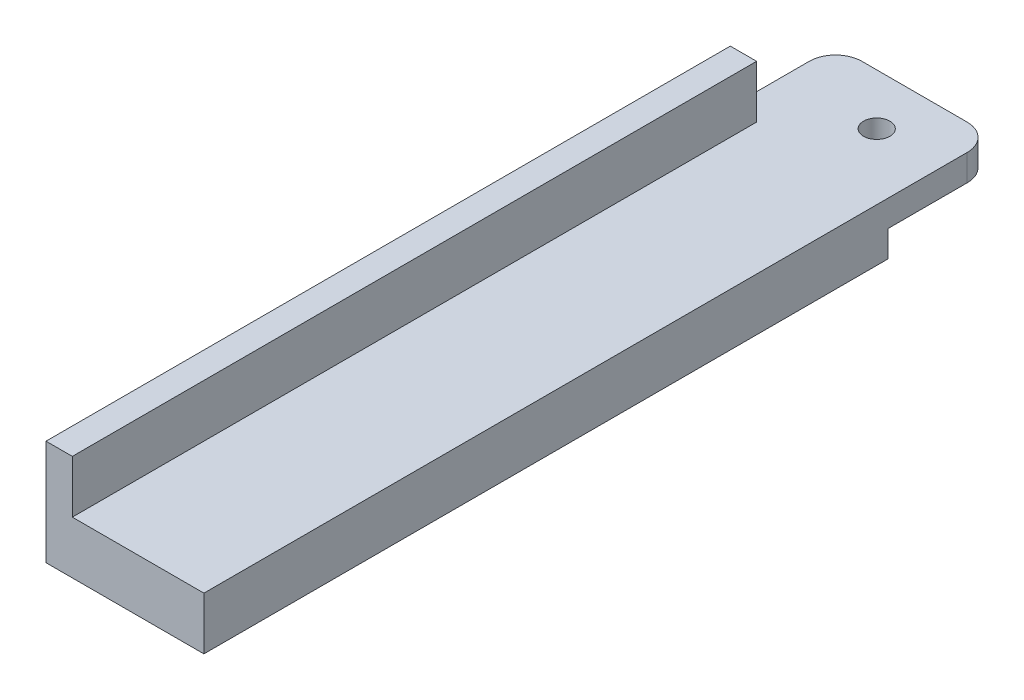
ISO-10303-21;
HEADER;
FILE_DESCRIPTION(('STEP AP214'),'2;1');
FILE_NAME('part.step','',(''),(''),'','','');
FILE_SCHEMA(('AUTOMOTIVE_DESIGN { 1 0 10303 214 1 1 1 1 }'));
ENDSEC;
DATA;
#1=APPLICATION_CONTEXT('core data for automotive mechanical design processes');
#2=APPLICATION_PROTOCOL_DEFINITION('international standard','automotive_design',2000,#1);
#3=PRODUCT_CONTEXT('',#1,'mechanical');
#4=PRODUCT('Part','Part','',(#3));
#5=PRODUCT_RELATED_PRODUCT_CATEGORY('part','',(#4));
#6=PRODUCT_DEFINITION_FORMATION('','',#4);
#7=PRODUCT_DEFINITION_CONTEXT('part definition',#1,'design');
#8=PRODUCT_DEFINITION('design','',#6,#7);
#9=PRODUCT_DEFINITION_SHAPE('','',#8);
#10=(LENGTH_UNIT() NAMED_UNIT(*) SI_UNIT(.MILLI.,.METRE.));
#11=(NAMED_UNIT(*) PLANE_ANGLE_UNIT() SI_UNIT($,.RADIAN.));
#12=(NAMED_UNIT(*) SI_UNIT($,.STERADIAN.) SOLID_ANGLE_UNIT());
#13=UNCERTAINTY_MEASURE_WITH_UNIT(LENGTH_MEASURE(1.E-05),#10,'distance_accuracy_value','');
#14=(GEOMETRIC_REPRESENTATION_CONTEXT(3) GLOBAL_UNCERTAINTY_ASSIGNED_CONTEXT((#13)) GLOBAL_UNIT_ASSIGNED_CONTEXT((#10,
#11,#12)) REPRESENTATION_CONTEXT('',''));
#15=CARTESIAN_POINT('',(0.,0.,0.));
#16=DIRECTION('',(0.,0.,1.));
#17=DIRECTION('',(1.,0.,0.));
#18=AXIS2_PLACEMENT_3D('',#15,#16,#17);
#19=CARTESIAN_POINT('',(10.,0.,300.));
#20=DIRECTION('',(0.,-1.,0.));
#21=DIRECTION('',(1.,0.,0.));
#22=AXIS2_PLACEMENT_3D('',#19,#20,#21);
#23=PLANE('',#22);
#24=DIRECTION('',(1.,0.,0.));
#25=VECTOR('',#24,1.);
#26=CARTESIAN_POINT('',(0.,0.,40.));
#27=LINE('',#26,#25);
#28=CARTESIAN_POINT('',(0.,0.,40.));
#29=VERTEX_POINT('',#28);
#30=CARTESIAN_POINT('',(10.,0.,40.));
#31=VERTEX_POINT('',#30);
#32=EDGE_CURVE('E164',#29,#31,#27,.T.);
#33=ORIENTED_EDGE('',*,*,#32,.F.);
#34=DIRECTION('',(0.,0.,-1.));
#35=VECTOR('',#34,1.);
#36=CARTESIAN_POINT('',(0.,0.,300.));
#37=LINE('',#36,#35);
#38=CARTESIAN_POINT('',(0.,0.,300.));
#39=VERTEX_POINT('',#38);
#40=EDGE_CURVE('E201',#39,#29,#37,.T.);
#41=ORIENTED_EDGE('',*,*,#40,.F.);
#42=DIRECTION('',(-1.,0.,0.));
#43=VECTOR('',#42,1.);
#44=CARTESIAN_POINT('',(10.,0.,300.));
#45=LINE('',#44,#43);
#46=CARTESIAN_POINT('',(10.,0.,300.));
#47=VERTEX_POINT('',#46);
#48=EDGE_CURVE('E174',#47,#39,#45,.T.);
#49=ORIENTED_EDGE('',*,*,#48,.F.);
#50=DIRECTION('',(0.,0.,-1.));
#51=VECTOR('',#50,1.);
#52=CARTESIAN_POINT('',(10.,0.,300.));
#53=LINE('',#52,#51);
#54=EDGE_CURVE('E187',#47,#31,#53,.T.);
#55=ORIENTED_EDGE('',*,*,#54,.T.);
#56=EDGE_LOOP('',(#33,#41,#49,#55));
#57=FACE_BOUND('',#56,.T.);
#58=ADVANCED_FACE('F40',(#57),#23,.F.);
#59=CARTESIAN_POINT('',(0.,-40.,300.));
#60=DIRECTION('',(0.,1.,0.));
#61=DIRECTION('',(-1.,0.,0.));
#62=AXIS2_PLACEMENT_3D('',#59,#60,#61);
#63=PLANE('',#62);
#64=DIRECTION('',(-1.,0.,0.));
#65=VECTOR('',#64,1.);
#66=CARTESIAN_POINT('',(60.,-40.,40.));
#67=LINE('',#66,#65);
#68=CARTESIAN_POINT('',(60.,-40.,40.));
#69=VERTEX_POINT('',#68);
#70=CARTESIAN_POINT('',(0.,-40.,40.));
#71=VERTEX_POINT('',#70);
#72=EDGE_CURVE('E151',#69,#71,#67,.T.);
#73=ORIENTED_EDGE('',*,*,#72,.F.);
#74=DIRECTION('',(0.,0.,-1.));
#75=VECTOR('',#74,1.);
#76=CARTESIAN_POINT('',(60.,-39.9999999999999,300.));
#77=LINE('',#76,#75);
#78=CARTESIAN_POINT('',(60.,-39.9999999999999,300.));
#79=VERTEX_POINT('',#78);
#80=EDGE_CURVE('E150',#79,#69,#77,.T.);
#81=ORIENTED_EDGE('',*,*,#80,.F.);
#82=DIRECTION('',(1.,0.,0.));
#83=VECTOR('',#82,1.);
#84=CARTESIAN_POINT('',(0.,-40.,300.));
#85=LINE('',#84,#83);
#86=CARTESIAN_POINT('',(0.,-40.,300.));
#87=VERTEX_POINT('',#86);
#88=EDGE_CURVE('E179',#87,#79,#85,.T.);
#89=ORIENTED_EDGE('',*,*,#88,.F.);
#90=DIRECTION('',(0.,0.,-1.));
#91=VECTOR('',#90,1.);
#92=CARTESIAN_POINT('',(0.,-40.,300.));
#93=LINE('',#92,#91);
#94=EDGE_CURVE('E198',#87,#71,#93,.T.);
#95=ORIENTED_EDGE('',*,*,#94,.T.);
#96=EDGE_LOOP('',(#73,#81,#89,#95));
#97=FACE_BOUND('',#96,.T.);
#98=ADVANCED_FACE('F236',(#97),#63,.F.);
#99=CARTESIAN_POINT('',(10.,-19.9999999999999,300.));
#100=DIRECTION('',(-1.,0.,0.));
#101=DIRECTION('',(0.,-1.,0.));
#102=AXIS2_PLACEMENT_3D('',#99,#100,#101);
#103=PLANE('',#102);
#104=DIRECTION('',(0.,-1.,0.));
#105=VECTOR('',#104,1.);
#106=CARTESIAN_POINT('',(10.,0.,40.));
#107=LINE('',#106,#105);
#108=CARTESIAN_POINT('',(10.,-20.,40.));
#109=VERTEX_POINT('',#108);
#110=EDGE_CURVE('E158',#31,#109,#107,.T.);
#111=ORIENTED_EDGE('',*,*,#110,.F.);
#112=ORIENTED_EDGE('',*,*,#54,.F.);
#113=DIRECTION('',(0.,1.,0.));
#114=VECTOR('',#113,1.);
#115=CARTESIAN_POINT('',(10.,-19.9999999999999,300.));
#116=LINE('',#115,#114);
#117=CARTESIAN_POINT('',(10.,-19.9999999999999,300.));
#118=VERTEX_POINT('',#117);
#119=EDGE_CURVE('E185',#118,#47,#116,.T.);
#120=ORIENTED_EDGE('',*,*,#119,.F.);
#121=DIRECTION('',(0.,0.,-1.));
#122=VECTOR('',#121,1.);
#123=CARTESIAN_POINT('',(10.,-19.9999999999999,300.));
#124=LINE('',#123,#122);
#125=EDGE_CURVE('E191',#118,#109,#124,.T.);
#126=ORIENTED_EDGE('',*,*,#125,.T.);
#127=EDGE_LOOP('',(#111,#112,#120,#126));
#128=FACE_BOUND('',#127,.T.);
#129=ADVANCED_FACE('F245',(#128),#103,.F.);
#130=CARTESIAN_POINT('',(0.,0.,300.));
#131=DIRECTION('',(1.,0.,0.));
#132=DIRECTION('',(0.,1.,0.));
#133=AXIS2_PLACEMENT_3D('',#130,#131,#132);
#134=PLANE('',#133);
#135=DIRECTION('',(0.,0.,-1.));
#136=VECTOR('',#135,1.);
#137=CARTESIAN_POINT('',(0.,-20.,40.));
#138=LINE('',#137,#136);
#139=CARTESIAN_POINT('',(0.,-20.,40.));
#140=VERTEX_POINT('',#139);
#141=CARTESIAN_POINT('',(0.,-20.,10.));
#142=VERTEX_POINT('',#141);
#143=EDGE_CURVE('E161',#140,#142,#138,.T.);
#144=ORIENTED_EDGE('',*,*,#143,.T.);
#145=DIRECTION('',(0.,-1.,0.));
#146=VECTOR('',#145,1.);
#147=CARTESIAN_POINT('',(0.,0.,10.));
#148=LINE('',#147,#146);
#149=CARTESIAN_POINT('',(0.,-30.,10.));
#150=VERTEX_POINT('',#149);
#151=EDGE_CURVE('E204',#142,#150,#148,.T.);
#152=ORIENTED_EDGE('',*,*,#151,.T.);
#153=DIRECTION('',(0.,0.,-1.));
#154=VECTOR('',#153,1.);
#155=CARTESIAN_POINT('',(0.,-30.,40.));
#156=LINE('',#155,#154);
#157=CARTESIAN_POINT('',(0.,-30.,40.));
#158=VERTEX_POINT('',#157);
#159=EDGE_CURVE('E135',#158,#150,#156,.T.);
#160=ORIENTED_EDGE('',*,*,#159,.F.);
#161=DIRECTION('',(0.,1.,0.));
#162=VECTOR('',#161,1.);
#163=CARTESIAN_POINT('',(0.,-30.,40.));
#164=LINE('',#163,#162);
#165=EDGE_CURVE('E136',#71,#158,#164,.T.);
#166=ORIENTED_EDGE('',*,*,#165,.F.);
#167=ORIENTED_EDGE('',*,*,#94,.F.);
#168=DIRECTION('',(0.,-1.,0.));
#169=VECTOR('',#168,1.);
#170=CARTESIAN_POINT('',(0.,0.,300.));
#171=LINE('',#170,#169);
#172=EDGE_CURVE('E177',#39,#87,#171,.T.);
#173=ORIENTED_EDGE('',*,*,#172,.F.);
#174=ORIENTED_EDGE('',*,*,#40,.T.);
#175=DIRECTION('',(0.,1.,0.));
#176=VECTOR('',#175,1.);
#177=CARTESIAN_POINT('',(0.,-20.,40.));
#178=LINE('',#177,#176);
#179=EDGE_CURVE('E167',#140,#29,#178,.T.);
#180=ORIENTED_EDGE('',*,*,#179,.F.);
#181=EDGE_LOOP('',(#144,#152,#160,#166,#167,#173,#174,#180));
#182=FACE_BOUND('',#181,.T.);
#183=ADVANCED_FACE('F223',(#182),#134,.F.);
#184=CARTESIAN_POINT('',(60.,-39.9999999999999,300.));
#185=DIRECTION('',(-1.,0.,0.));
#186=DIRECTION('',(0.,0.,1.));
#187=AXIS2_PLACEMENT_3D('',#184,#185,#186);
#188=PLANE('',#187);
#189=DIRECTION('',(0.,0.,-1.));
#190=VECTOR('',#189,1.);
#191=CARTESIAN_POINT('',(60.,-30.,40.));
#192=LINE('',#191,#190);
#193=CARTESIAN_POINT('',(60.,-30.,40.));
#194=VERTEX_POINT('',#193);
#195=CARTESIAN_POINT('',(60.,-30.,10.));
#196=VERTEX_POINT('',#195);
#197=EDGE_CURVE('E124',#194,#196,#192,.T.);
#198=ORIENTED_EDGE('',*,*,#197,.T.);
#199=DIRECTION('',(0.,1.,0.));
#200=VECTOR('',#199,1.);
#201=CARTESIAN_POINT('',(60.,-39.9999999999999,10.));
#202=LINE('',#201,#200);
#203=CARTESIAN_POINT('',(60.,-19.9999999999999,10.));
#204=VERTEX_POINT('',#203);
#205=EDGE_CURVE('E11',#196,#204,#202,.T.);
#206=ORIENTED_EDGE('',*,*,#205,.T.);
#207=DIRECTION('',(0.,0.,-1.));
#208=VECTOR('',#207,1.);
#209=CARTESIAN_POINT('',(60.,-19.9999999999999,300.));
#210=LINE('',#209,#208);
#211=CARTESIAN_POINT('',(60.,-19.9999999999999,300.));
#212=VERTEX_POINT('',#211);
#213=EDGE_CURVE('E194',#212,#204,#210,.T.);
#214=ORIENTED_EDGE('',*,*,#213,.F.);
#215=DIRECTION('',(0.,1.,0.));
#216=VECTOR('',#215,1.);
#217=CARTESIAN_POINT('',(60.,-39.9999999999999,300.));
#218=LINE('',#217,#216);
#219=EDGE_CURVE('E181',#79,#212,#218,.T.);
#220=ORIENTED_EDGE('',*,*,#219,.F.);
#221=ORIENTED_EDGE('',*,*,#80,.T.);
#222=DIRECTION('',(0.,-1.,0.));
#223=VECTOR('',#222,1.);
#224=CARTESIAN_POINT('',(60.,-30.,40.));
#225=LINE('',#224,#223);
#226=EDGE_CURVE('E140',#194,#69,#225,.T.);
#227=ORIENTED_EDGE('',*,*,#226,.F.);
#228=EDGE_LOOP('',(#198,#206,#214,#220,#221,#227));
#229=FACE_BOUND('',#228,.T.);
#230=ADVANCED_FACE('F147',(#229),#188,.F.);
#231=CARTESIAN_POINT('',(60.,-19.9999999999999,300.));
#232=DIRECTION('',(0.,-1.,0.));
#233=DIRECTION('',(1.,0.,0.));
#234=AXIS2_PLACEMENT_3D('',#231,#232,#233);
#235=PLANE('',#234);
#236=CARTESIAN_POINT('',(35.,-19.9999999999999,19.3649167310371));
#237=DIRECTION('',(0.,1.,0.));
#238=DIRECTION('',(-1.,0.,0.));
#239=AXIS2_PLACEMENT_3D('',#236,#237,#238);
#240=CIRCLE('',#239,5.);
#241=CARTESIAN_POINT('',(30.,-19.9999999999999,19.3649167310371));
#242=VERTEX_POINT('',#241);
#243=EDGE_CURVE('E207',#242,#242,#240,.T.);
#244=ORIENTED_EDGE('',*,*,#243,.F.);
#245=EDGE_LOOP('',(#244));
#246=FACE_BOUND('',#245,.T.);
#247=DIRECTION('',(-1.,0.,0.));
#248=VECTOR('',#247,1.);
#249=CARTESIAN_POINT('',(60.,-19.9999999999999,0.));
#250=LINE('',#249,#248);
#251=CARTESIAN_POINT('',(50.,-19.9999999999999,0.));
#252=VERTEX_POINT('',#251);
#253=CARTESIAN_POINT('',(10.,-19.9999999999999,0.));
#254=VERTEX_POINT('',#253);
#255=EDGE_CURVE('E159',#252,#254,#250,.T.);
#256=ORIENTED_EDGE('',*,*,#255,.T.);
#257=CARTESIAN_POINT('',(10.,-19.9999999999999,10.));
#258=DIRECTION('',(0.,-1.,0.));
#259=DIRECTION('',(1.,0.,0.));
#260=AXIS2_PLACEMENT_3D('',#257,#258,#259);
#261=CIRCLE('',#260,10.);
#262=EDGE_CURVE('E48',#254,#142,#261,.F.);
#263=ORIENTED_EDGE('',*,*,#262,.T.);
#264=ORIENTED_EDGE('',*,*,#143,.F.);
#265=DIRECTION('',(-1.,0.,0.));
#266=VECTOR('',#265,1.);
#267=CARTESIAN_POINT('',(10.,-20.,40.));
#268=LINE('',#267,#266);
#269=EDGE_CURVE('E169',#109,#140,#268,.T.);
#270=ORIENTED_EDGE('',*,*,#269,.F.);
#271=ORIENTED_EDGE('',*,*,#125,.F.);
#272=DIRECTION('',(-1.,0.,0.));
#273=VECTOR('',#272,1.);
#274=CARTESIAN_POINT('',(60.,-19.9999999999999,300.));
#275=LINE('',#274,#273);
#276=EDGE_CURVE('E183',#212,#118,#275,.T.);
#277=ORIENTED_EDGE('',*,*,#276,.F.);
#278=ORIENTED_EDGE('',*,*,#213,.T.);
#279=CARTESIAN_POINT('',(50.,-19.9999999999999,10.));
#280=DIRECTION('',(0.,-1.,0.));
#281=DIRECTION('',(1.,0.,0.));
#282=AXIS2_PLACEMENT_3D('',#279,#280,#281);
#283=CIRCLE('',#282,10.);
#284=EDGE_CURVE('E55',#204,#252,#283,.F.);
#285=ORIENTED_EDGE('',*,*,#284,.T.);
#286=EDGE_LOOP('',(#256,#263,#264,#270,#271,#277,#278,#285));
#287=FACE_BOUND('',#286,.T.);
#288=ADVANCED_FACE('F218',(#246,#287),#235,.F.);
#289=CARTESIAN_POINT('',(0.,0.,300.));
#290=DIRECTION('',(0.,0.,1.));
#291=DIRECTION('',(1.,0.,0.));
#292=AXIS2_PLACEMENT_3D('',#289,#290,#291);
#293=PLANE('',#292);
#294=ORIENTED_EDGE('',*,*,#48,.T.);
#295=ORIENTED_EDGE('',*,*,#172,.T.);
#296=ORIENTED_EDGE('',*,*,#88,.T.);
#297=ORIENTED_EDGE('',*,*,#219,.T.);
#298=ORIENTED_EDGE('',*,*,#276,.T.);
#299=ORIENTED_EDGE('',*,*,#119,.T.);
#300=EDGE_LOOP('',(#294,#295,#296,#297,#298,#299));
#301=FACE_BOUND('',#300,.T.);
#302=ADVANCED_FACE('F231',(#301),#293,.T.);
#303=CARTESIAN_POINT('',(0.,0.,0.));
#304=DIRECTION('',(0.,0.,1.));
#305=DIRECTION('',(1.,0.,0.));
#306=AXIS2_PLACEMENT_3D('',#303,#304,#305);
#307=PLANE('',#306);
#308=DIRECTION('',(1.,0.,0.));
#309=VECTOR('',#308,1.);
#310=CARTESIAN_POINT('',(10.,-30.,0.));
#311=LINE('',#310,#309);
#312=CARTESIAN_POINT('',(10.,-30.,0.));
#313=VERTEX_POINT('',#312);
#314=CARTESIAN_POINT('',(50.,-30.,0.));
#315=VERTEX_POINT('',#314);
#316=EDGE_CURVE('E144',#313,#315,#311,.T.);
#317=ORIENTED_EDGE('',*,*,#316,.F.);
#318=DIRECTION('',(0.,-1.,0.));
#319=VECTOR('',#318,1.);
#320=CARTESIAN_POINT('',(10.,0.,0.));
#321=LINE('',#320,#319);
#322=EDGE_CURVE('E62',#313,#254,#321,.F.);
#323=ORIENTED_EDGE('',*,*,#322,.T.);
#324=ORIENTED_EDGE('',*,*,#255,.F.);
#325=DIRECTION('',(0.,1.,0.));
#326=VECTOR('',#325,1.);
#327=CARTESIAN_POINT('',(50.,0.,0.));
#328=LINE('',#327,#326);
#329=EDGE_CURVE('E213',#252,#315,#328,.F.);
#330=ORIENTED_EDGE('',*,*,#329,.T.);
#331=EDGE_LOOP('',(#317,#323,#324,#330));
#332=FACE_BOUND('',#331,.T.);
#333=ADVANCED_FACE('F225',(#332),#307,.F.);
#334=CARTESIAN_POINT('',(0.,0.,40.));
#335=DIRECTION('',(0.,0.,-1.));
#336=DIRECTION('',(-1.,0.,0.));
#337=AXIS2_PLACEMENT_3D('',#334,#335,#336);
#338=PLANE('',#337);
#339=ORIENTED_EDGE('',*,*,#110,.T.);
#340=ORIENTED_EDGE('',*,*,#269,.T.);
#341=ORIENTED_EDGE('',*,*,#179,.T.);
#342=ORIENTED_EDGE('',*,*,#32,.T.);
#343=EDGE_LOOP('',(#339,#340,#341,#342));
#344=FACE_BOUND('',#343,.T.);
#345=ADVANCED_FACE('F243',(#344),#338,.T.);
#346=CARTESIAN_POINT('',(10.,-30.,40.));
#347=DIRECTION('',(0.,1.,0.));
#348=DIRECTION('',(0.,0.,1.));
#349=AXIS2_PLACEMENT_3D('',#346,#347,#348);
#350=PLANE('',#349);
#351=CARTESIAN_POINT('',(35.,-30.,19.3649167310371));
#352=DIRECTION('',(0.,1.,0.));
#353=DIRECTION('',(0.,0.,1.));
#354=AXIS2_PLACEMENT_3D('',#351,#352,#353);
#355=CIRCLE('',#354,5.);
#356=CARTESIAN_POINT('',(35.,-30.,24.3649167310371));
#357=VERTEX_POINT('',#356);
#358=EDGE_CURVE('E165',#357,#357,#355,.T.);
#359=ORIENTED_EDGE('',*,*,#358,.T.);
#360=EDGE_LOOP('',(#359));
#361=FACE_BOUND('',#360,.T.);
#362=ORIENTED_EDGE('',*,*,#159,.T.);
#363=CARTESIAN_POINT('',(10.,-30.,10.));
#364=DIRECTION('',(0.,1.,0.));
#365=DIRECTION('',(0.,0.,1.));
#366=AXIS2_PLACEMENT_3D('',#363,#364,#365);
#367=CIRCLE('',#366,10.);
#368=EDGE_CURVE('E211',#150,#313,#367,.F.);
#369=ORIENTED_EDGE('',*,*,#368,.T.);
#370=ORIENTED_EDGE('',*,*,#316,.T.);
#371=CARTESIAN_POINT('',(50.,-30.,10.));
#372=DIRECTION('',(0.,1.,0.));
#373=DIRECTION('',(0.,0.,1.));
#374=AXIS2_PLACEMENT_3D('',#371,#372,#373);
#375=CIRCLE('',#374,10.);
#376=EDGE_CURVE('E132',#315,#196,#375,.F.);
#377=ORIENTED_EDGE('',*,*,#376,.T.);
#378=ORIENTED_EDGE('',*,*,#197,.F.);
#379=DIRECTION('',(1.,0.,0.));
#380=VECTOR('',#379,1.);
#381=CARTESIAN_POINT('',(10.,-30.,40.));
#382=LINE('',#381,#380);
#383=EDGE_CURVE('E128',#158,#194,#382,.T.);
#384=ORIENTED_EDGE('',*,*,#383,.F.);
#385=EDGE_LOOP('',(#362,#369,#370,#377,#378,#384));
#386=FACE_BOUND('',#385,.T.);
#387=ADVANCED_FACE('F127',(#361,#386),#350,.F.);
#388=CARTESIAN_POINT('',(0.,0.,40.));
#389=DIRECTION('',(0.,0.,-1.));
#390=DIRECTION('',(-1.,0.,0.));
#391=AXIS2_PLACEMENT_3D('',#388,#389,#390);
#392=PLANE('',#391);
#393=ORIENTED_EDGE('',*,*,#383,.T.);
#394=ORIENTED_EDGE('',*,*,#226,.T.);
#395=ORIENTED_EDGE('',*,*,#72,.T.);
#396=ORIENTED_EDGE('',*,*,#165,.T.);
#397=EDGE_LOOP('',(#393,#394,#395,#396));
#398=FACE_BOUND('',#397,.T.);
#399=ADVANCED_FACE('F139',(#398),#392,.T.);
#400=CARTESIAN_POINT('',(35.,-40.,19.3649167310371));
#401=DIRECTION('',(0.,1.,0.));
#402=DIRECTION('',(-1.,0.,0.));
#403=AXIS2_PLACEMENT_3D('',#400,#401,#402);
#404=CYLINDRICAL_SURFACE('',#403,5.);
#405=ORIENTED_EDGE('',*,*,#243,.T.);
#406=EDGE_LOOP('',(#405));
#407=FACE_BOUND('',#406,.T.);
#408=ORIENTED_EDGE('',*,*,#358,.F.);
#409=EDGE_LOOP('',(#408));
#410=FACE_BOUND('',#409,.T.);
#411=ADVANCED_FACE('F261',(#407,#410),#404,.F.);
#412=CARTESIAN_POINT('',(10.,0.,10.));
#413=DIRECTION('',(0.,-1.,0.));
#414=DIRECTION('',(1.,0.,0.));
#415=AXIS2_PLACEMENT_3D('',#412,#413,#414);
#416=CYLINDRICAL_SURFACE('',#415,10.);
#417=ORIENTED_EDGE('',*,*,#262,.F.);
#418=ORIENTED_EDGE('',*,*,#322,.F.);
#419=ORIENTED_EDGE('',*,*,#368,.F.);
#420=ORIENTED_EDGE('',*,*,#151,.F.);
#421=EDGE_LOOP('',(#417,#418,#419,#420));
#422=FACE_BOUND('',#421,.T.);
#423=ADVANCED_FACE('F224',(#422),#416,.T.);
#424=CARTESIAN_POINT('',(50.,-39.9999999999999,10.));
#425=DIRECTION('',(0.,1.,0.));
#426=DIRECTION('',(0.,0.,1.));
#427=AXIS2_PLACEMENT_3D('',#424,#425,#426);
#428=CYLINDRICAL_SURFACE('',#427,10.);
#429=ORIENTED_EDGE('',*,*,#376,.F.);
#430=ORIENTED_EDGE('',*,*,#329,.F.);
#431=ORIENTED_EDGE('',*,*,#284,.F.);
#432=ORIENTED_EDGE('',*,*,#205,.F.);
#433=EDGE_LOOP('',(#429,#430,#431,#432));
#434=FACE_BOUND('',#433,.T.);
#435=ADVANCED_FACE('F42',(#434),#428,.T.);
#436=CLOSED_SHELL('',(#58,#98,#129,#183,#230,#288,#302,#333,#345,#387,#399,#411,#423,#435));
#437=MANIFOLD_SOLID_BREP('B2',#436);
#438=ADVANCED_BREP_SHAPE_REPRESENTATION('',(#18,#437),#14);
#439=SHAPE_DEFINITION_REPRESENTATION(#9,#438);
ENDSEC;
END-ISO-10303-21;
